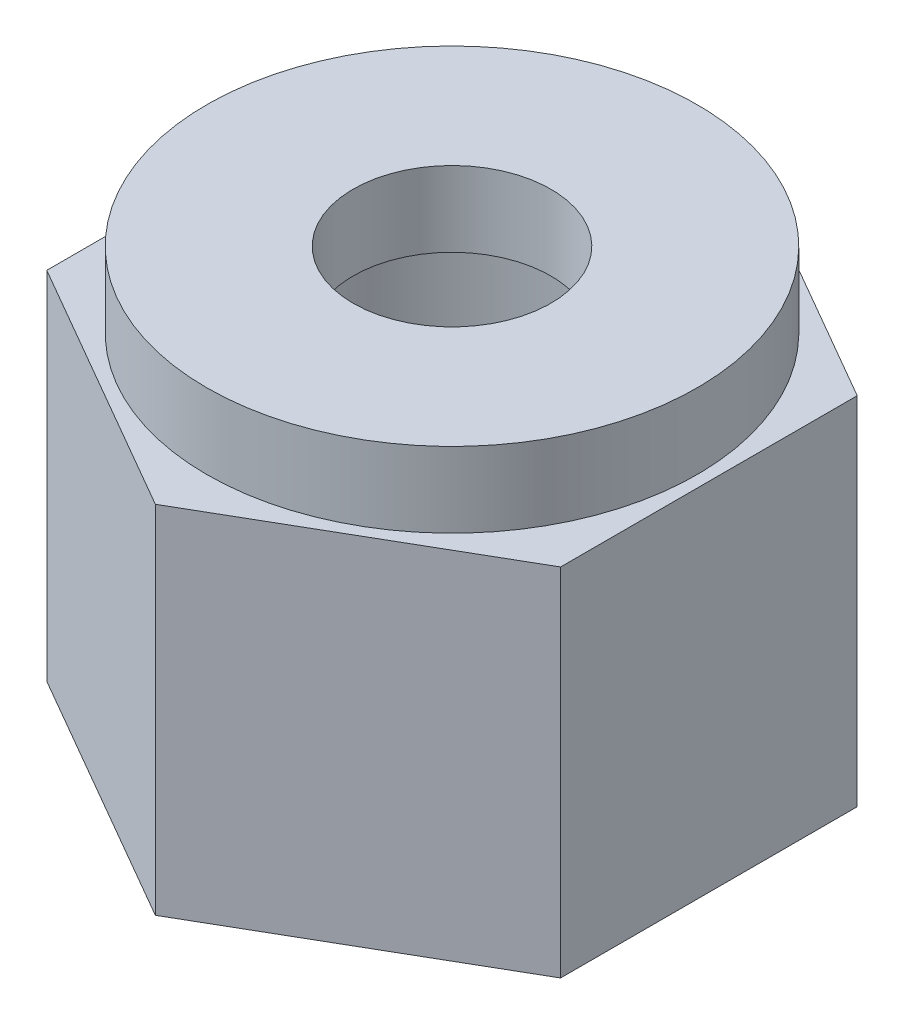
ISO-10303-21;
HEADER;
FILE_DESCRIPTION(('STEP AP214'),'2;1');
FILE_NAME('part.step','',(''),(''),'','','');
FILE_SCHEMA(('AUTOMOTIVE_DESIGN { 1 0 10303 214 1 1 1 1 }'));
ENDSEC;
DATA;
#1=APPLICATION_CONTEXT('core data for automotive mechanical design processes');
#2=APPLICATION_PROTOCOL_DEFINITION('international standard','automotive_design',2000,#1);
#3=PRODUCT_CONTEXT('',#1,'mechanical');
#4=PRODUCT('Part','Part','',(#3));
#5=PRODUCT_RELATED_PRODUCT_CATEGORY('part','',(#4));
#6=PRODUCT_DEFINITION_FORMATION('','',#4);
#7=PRODUCT_DEFINITION_CONTEXT('part definition',#1,'design');
#8=PRODUCT_DEFINITION('design','',#6,#7);
#9=PRODUCT_DEFINITION_SHAPE('','',#8);
#10=(LENGTH_UNIT() NAMED_UNIT(*) SI_UNIT(.MILLI.,.METRE.));
#11=(NAMED_UNIT(*) PLANE_ANGLE_UNIT() SI_UNIT($,.RADIAN.));
#12=(NAMED_UNIT(*) SI_UNIT($,.STERADIAN.) SOLID_ANGLE_UNIT());
#13=UNCERTAINTY_MEASURE_WITH_UNIT(LENGTH_MEASURE(1.E-05),#10,'distance_accuracy_value','');
#14=(GEOMETRIC_REPRESENTATION_CONTEXT(3) GLOBAL_UNCERTAINTY_ASSIGNED_CONTEXT((#13)) GLOBAL_UNIT_ASSIGNED_CONTEXT((#10,
#11,#12)) REPRESENTATION_CONTEXT('',''));
#15=CARTESIAN_POINT('',(0.,0.,0.));
#16=DIRECTION('',(0.,0.,1.));
#17=DIRECTION('',(1.,0.,0.));
#18=AXIS2_PLACEMENT_3D('',#15,#16,#17);
#19=CARTESIAN_POINT('',(0.,0.,0.));
#20=DIRECTION('',(0.,1.,0.));
#21=DIRECTION('',(0.,0.,1.));
#22=AXIS2_PLACEMENT_3D('',#19,#20,#21);
#23=PLANE('',#22);
#24=DIRECTION('',(-0.866025403784441,0.,-0.499999999999995));
#25=VECTOR('',#24,1.);
#26=CARTESIAN_POINT('',(12.9903810567665,0.,-7.50000000000014));
#27=LINE('',#26,#25);
#28=CARTESIAN_POINT('',(12.9903810567665,0.,-7.50000000000014));
#29=VERTEX_POINT('',#28);
#30=CARTESIAN_POINT('',(0.,0.,-15.));
#31=VERTEX_POINT('',#30);
#32=EDGE_CURVE('E296',#29,#31,#27,.T.);
#33=ORIENTED_EDGE('',*,*,#32,.T.);
#34=DIRECTION('',(-0.866025403784438,0.,0.500000000000001));
#35=VECTOR('',#34,1.);
#36=CARTESIAN_POINT('',(0.,0.,-15.));
#37=LINE('',#36,#35);
#38=CARTESIAN_POINT('',(-12.9903810567666,0.,-7.49999999999995));
#39=VERTEX_POINT('',#38);
#40=EDGE_CURVE('E308',#31,#39,#37,.T.);
#41=ORIENTED_EDGE('',*,*,#40,.T.);
#42=DIRECTION('',(0.,0.,1.));
#43=VECTOR('',#42,1.);
#44=CARTESIAN_POINT('',(-12.9903810567666,0.,-7.49999999999995));
#45=LINE('',#44,#43);
#46=CARTESIAN_POINT('',(-12.9903810567665,0.,7.50000000000004));
#47=VERTEX_POINT('',#46);
#48=EDGE_CURVE('E317',#39,#47,#45,.T.);
#49=ORIENTED_EDGE('',*,*,#48,.T.);
#50=DIRECTION('',(0.866025403784442,0.,0.499999999999995));
#51=VECTOR('',#50,1.);
#52=CARTESIAN_POINT('',(-12.9903810567665,0.,7.50000000000004));
#53=LINE('',#52,#51);
#54=CARTESIAN_POINT('',(1.02348685082632E-13,0.,15.));
#55=VERTEX_POINT('',#54);
#56=EDGE_CURVE('E142',#47,#55,#53,.T.);
#57=ORIENTED_EDGE('',*,*,#56,.T.);
#58=DIRECTION('',(0.866025403784435,0.,-0.500000000000007));
#59=VECTOR('',#58,1.);
#60=CARTESIAN_POINT('',(1.04744440165294E-13,0.,15.));
#61=LINE('',#60,#59);
#62=CARTESIAN_POINT('',(12.9903810567666,0.,7.49999999999986));
#63=VERTEX_POINT('',#62);
#64=EDGE_CURVE('E64',#55,#63,#61,.T.);
#65=ORIENTED_EDGE('',*,*,#64,.T.);
#66=DIRECTION('',(0.,0.,-1.));
#67=VECTOR('',#66,1.);
#68=CARTESIAN_POINT('',(12.9903810567666,0.,7.49999999999986));
#69=LINE('',#68,#67);
#70=EDGE_CURVE('E12',#63,#29,#69,.T.);
#71=ORIENTED_EDGE('',*,*,#70,.T.);
#72=EDGE_LOOP('',(#33,#41,#49,#57,#65,#71));
#73=FACE_BOUND('',#72,.T.);
#74=CARTESIAN_POINT('',(0.,0.,0.));
#75=DIRECTION('',(0.,1.,0.));
#76=DIRECTION('',(0.,0.,1.));
#77=AXIS2_PLACEMENT_3D('',#74,#75,#76);
#78=CIRCLE('',#77,12.4);
#79=CARTESIAN_POINT('',(0.,0.,12.4));
#80=VERTEX_POINT('',#79);
#81=EDGE_CURVE('E404',#80,#80,#78,.T.);
#82=ORIENTED_EDGE('',*,*,#81,.F.);
#83=EDGE_LOOP('',(#82));
#84=FACE_BOUND('',#83,.T.);
#85=ADVANCED_FACE('F55',(#73,#84),#23,.T.);
#86=CARTESIAN_POINT('',(0.,-18.,0.));
#87=DIRECTION('',(0.,1.,0.));
#88=DIRECTION('',(0.,0.,1.));
#89=AXIS2_PLACEMENT_3D('',#86,#87,#88);
#90=PLANE('',#89);
#91=CARTESIAN_POINT('',(0.,-18.,0.));
#92=DIRECTION('',(0.,-1.,0.));
#93=DIRECTION('',(0.,0.,-1.));
#94=AXIS2_PLACEMENT_3D('',#91,#92,#93);
#95=CIRCLE('',#94,10.188);
#96=CARTESIAN_POINT('',(0.,-18.,-10.188));
#97=VERTEX_POINT('',#96);
#98=EDGE_CURVE('E136',#97,#97,#95,.T.);
#99=ORIENTED_EDGE('',*,*,#98,.F.);
#100=EDGE_LOOP('',(#99));
#101=FACE_BOUND('',#100,.T.);
#102=DIRECTION('',(0.,0.,1.));
#103=VECTOR('',#102,1.);
#104=CARTESIAN_POINT('',(-12.9903810567666,-18.,-7.49999999999995));
#105=LINE('',#104,#103);
#106=CARTESIAN_POINT('',(-12.9903810567666,-18.,-7.49999999999995));
#107=VERTEX_POINT('',#106);
#108=CARTESIAN_POINT('',(-12.9903810567665,-18.,7.50000000000004));
#109=VERTEX_POINT('',#108);
#110=EDGE_CURVE('E115',#107,#109,#105,.T.);
#111=ORIENTED_EDGE('',*,*,#110,.F.);
#112=DIRECTION('',(-0.866025403784438,0.,0.500000000000001));
#113=VECTOR('',#112,1.);
#114=CARTESIAN_POINT('',(0.,-18.,-15.));
#115=LINE('',#114,#113);
#116=CARTESIAN_POINT('',(0.,-18.,-15.));
#117=VERTEX_POINT('',#116);
#118=EDGE_CURVE('E144',#117,#107,#115,.T.);
#119=ORIENTED_EDGE('',*,*,#118,.F.);
#120=DIRECTION('',(-0.866025403784441,0.,-0.499999999999995));
#121=VECTOR('',#120,1.);
#122=CARTESIAN_POINT('',(12.9903810567665,-18.,-7.50000000000014));
#123=LINE('',#122,#121);
#124=CARTESIAN_POINT('',(12.9903810567665,-18.,-7.50000000000014));
#125=VERTEX_POINT('',#124);
#126=EDGE_CURVE('E148',#125,#117,#123,.T.);
#127=ORIENTED_EDGE('',*,*,#126,.F.);
#128=DIRECTION('',(0.,0.,-1.));
#129=VECTOR('',#128,1.);
#130=CARTESIAN_POINT('',(12.9903810567666,-18.,7.49999999999986));
#131=LINE('',#130,#129);
#132=CARTESIAN_POINT('',(12.9903810567666,-18.,7.49999999999986));
#133=VERTEX_POINT('',#132);
#134=EDGE_CURVE('E248',#133,#125,#131,.T.);
#135=ORIENTED_EDGE('',*,*,#134,.F.);
#136=DIRECTION('',(0.866025403784435,0.,-0.500000000000007));
#137=VECTOR('',#136,1.);
#138=CARTESIAN_POINT('',(1.04744440165294E-13,-18.,15.));
#139=LINE('',#138,#137);
#140=CARTESIAN_POINT('',(1.04744440165294E-13,-18.,15.));
#141=VERTEX_POINT('',#140);
#142=EDGE_CURVE('E117',#141,#133,#139,.T.);
#143=ORIENTED_EDGE('',*,*,#142,.F.);
#144=DIRECTION('',(0.866025403784442,0.,0.499999999999995));
#145=VECTOR('',#144,1.);
#146=CARTESIAN_POINT('',(-12.9903810567665,-18.,7.50000000000004));
#147=LINE('',#146,#145);
#148=EDGE_CURVE('E111',#109,#141,#147,.T.);
#149=ORIENTED_EDGE('',*,*,#148,.F.);
#150=EDGE_LOOP('',(#111,#119,#127,#135,#143,#149));
#151=FACE_BOUND('',#150,.T.);
#152=ADVANCED_FACE('F114',(#101,#151),#90,.F.);
#153=CARTESIAN_POINT('',(-12.9903810567665,0.,0.));
#154=DIRECTION('',(1.,0.,0.));
#155=DIRECTION('',(0.,0.,-1.));
#156=AXIS2_PLACEMENT_3D('',#153,#154,#155);
#157=PLANE('',#156);
#158=DIRECTION('',(0.,1.,0.));
#159=VECTOR('',#158,1.);
#160=CARTESIAN_POINT('',(-12.9903810567665,-18.,7.50000000000004));
#161=LINE('',#160,#159);
#162=EDGE_CURVE('E131',#109,#47,#161,.T.);
#163=ORIENTED_EDGE('',*,*,#162,.T.);
#164=ORIENTED_EDGE('',*,*,#48,.F.);
#165=DIRECTION('',(0.,1.,0.));
#166=VECTOR('',#165,1.);
#167=CARTESIAN_POINT('',(-12.9903810567666,-18.,-7.49999999999995));
#168=LINE('',#167,#166);
#169=EDGE_CURVE('E134',#107,#39,#168,.T.);
#170=ORIENTED_EDGE('',*,*,#169,.F.);
#171=ORIENTED_EDGE('',*,*,#110,.T.);
#172=EDGE_LOOP('',(#163,#164,#170,#171));
#173=FACE_BOUND('',#172,.T.);
#174=ADVANCED_FACE('F130',(#173),#157,.F.);
#175=CARTESIAN_POINT('',(-6.49519052838329,0.,-11.25));
#176=DIRECTION('',(0.500000000000001,0.,0.866025403784438));
#177=DIRECTION('',(0.866025403784438,0.,-0.500000000000001));
#178=AXIS2_PLACEMENT_3D('',#175,#176,#177);
#179=PLANE('',#178);
#180=ORIENTED_EDGE('',*,*,#169,.T.);
#181=ORIENTED_EDGE('',*,*,#40,.F.);
#182=DIRECTION('',(0.,1.,0.));
#183=VECTOR('',#182,1.);
#184=CARTESIAN_POINT('',(0.,-18.,-15.));
#185=LINE('',#184,#183);
#186=EDGE_CURVE('E265',#117,#31,#185,.T.);
#187=ORIENTED_EDGE('',*,*,#186,.F.);
#188=ORIENTED_EDGE('',*,*,#118,.T.);
#189=EDGE_LOOP('',(#180,#181,#187,#188));
#190=FACE_BOUND('',#189,.T.);
#191=ADVANCED_FACE('F171',(#190),#179,.F.);
#192=CARTESIAN_POINT('',(-6.49519052838321,0.,11.25));
#193=DIRECTION('',(0.499999999999995,0.,-0.866025403784442));
#194=DIRECTION('',(-0.866025403784442,0.,-0.499999999999995));
#195=AXIS2_PLACEMENT_3D('',#192,#193,#194);
#196=PLANE('',#195);
#197=DIRECTION('',(0.,1.,0.));
#198=VECTOR('',#197,1.);
#199=CARTESIAN_POINT('',(1.04744440165294E-13,-18.,15.));
#200=LINE('',#199,#198);
#201=EDGE_CURVE('E146',#141,#55,#200,.T.);
#202=ORIENTED_EDGE('',*,*,#201,.T.);
#203=ORIENTED_EDGE('',*,*,#56,.F.);
#204=ORIENTED_EDGE('',*,*,#162,.F.);
#205=ORIENTED_EDGE('',*,*,#148,.T.);
#206=EDGE_LOOP('',(#202,#203,#204,#205));
#207=FACE_BOUND('',#206,.T.);
#208=ADVANCED_FACE('F140',(#207),#196,.F.);
#209=CARTESIAN_POINT('',(6.49519052838336,0.,11.2499999999999));
#210=DIRECTION('',(-0.500000000000007,0.,-0.866025403784435));
#211=DIRECTION('',(-0.866025403784435,0.,0.500000000000007));
#212=AXIS2_PLACEMENT_3D('',#209,#210,#211);
#213=PLANE('',#212);
#214=DIRECTION('',(0.,1.,0.));
#215=VECTOR('',#214,1.);
#216=CARTESIAN_POINT('',(12.9903810567666,-18.,7.49999999999986));
#217=LINE('',#216,#215);
#218=EDGE_CURVE('E79',#133,#63,#217,.T.);
#219=ORIENTED_EDGE('',*,*,#218,.T.);
#220=ORIENTED_EDGE('',*,*,#64,.F.);
#221=ORIENTED_EDGE('',*,*,#201,.F.);
#222=ORIENTED_EDGE('',*,*,#142,.T.);
#223=EDGE_LOOP('',(#219,#220,#221,#222));
#224=FACE_BOUND('',#223,.T.);
#225=ADVANCED_FACE('F170',(#224),#213,.F.);
#226=CARTESIAN_POINT('',(12.9903810567665,0.,-1.36710628485081E-13));
#227=DIRECTION('',(-1.,0.,0.));
#228=DIRECTION('',(0.,0.,1.));
#229=AXIS2_PLACEMENT_3D('',#226,#227,#228);
#230=PLANE('',#229);
#231=DIRECTION('',(0.,1.,0.));
#232=VECTOR('',#231,1.);
#233=CARTESIAN_POINT('',(12.9903810567665,-18.,-7.50000000000014));
#234=LINE('',#233,#232);
#235=EDGE_CURVE('E263',#125,#29,#234,.T.);
#236=ORIENTED_EDGE('',*,*,#235,.T.);
#237=ORIENTED_EDGE('',*,*,#70,.F.);
#238=ORIENTED_EDGE('',*,*,#218,.F.);
#239=ORIENTED_EDGE('',*,*,#134,.T.);
#240=EDGE_LOOP('',(#236,#237,#238,#239));
#241=FACE_BOUND('',#240,.T.);
#242=ADVANCED_FACE('F261',(#241),#230,.F.);
#243=CARTESIAN_POINT('',(6.49519052838323,0.,-11.2500000000001));
#244=DIRECTION('',(-0.499999999999995,0.,0.866025403784442));
#245=DIRECTION('',(0.866025403784442,0.,0.499999999999995));
#246=AXIS2_PLACEMENT_3D('',#243,#244,#245);
#247=PLANE('',#246);
#248=ORIENTED_EDGE('',*,*,#186,.T.);
#249=ORIENTED_EDGE('',*,*,#32,.F.);
#250=ORIENTED_EDGE('',*,*,#235,.F.);
#251=ORIENTED_EDGE('',*,*,#126,.T.);
#252=EDGE_LOOP('',(#248,#249,#250,#251));
#253=FACE_BOUND('',#252,.T.);
#254=ADVANCED_FACE('F282',(#253),#247,.F.);
#255=CARTESIAN_POINT('',(0.,9.99999999994061E-05,0.));
#256=DIRECTION('',(0.,-1.,0.));
#257=DIRECTION('',(0.,0.,-1.));
#258=AXIS2_PLACEMENT_3D('',#255,#256,#257);
#259=CYLINDRICAL_SURFACE('',#258,10.188);
#260=CARTESIAN_POINT('',(0.,0.,0.));
#261=DIRECTION('',(0.,1.,0.));
#262=DIRECTION('',(0.,0.,1.));
#263=AXIS2_PLACEMENT_3D('',#260,#261,#262);
#264=CIRCLE('',#263,10.188);
#265=CARTESIAN_POINT('',(0.,0.,10.188));
#266=VERTEX_POINT('',#265);
#267=EDGE_CURVE('E401',#266,#266,#264,.T.);
#268=ORIENTED_EDGE('',*,*,#267,.T.);
#269=EDGE_LOOP('',(#268));
#270=FACE_BOUND('',#269,.T.);
#271=ORIENTED_EDGE('',*,*,#98,.T.);
#272=EDGE_LOOP('',(#271));
#273=FACE_BOUND('',#272,.T.);
#274=ADVANCED_FACE('F219',(#270,#273),#259,.F.);
#275=CARTESIAN_POINT('',(0.,3.8,0.));
#276=DIRECTION('',(0.,-1.,0.));
#277=DIRECTION('',(0.,0.,-1.));
#278=AXIS2_PLACEMENT_3D('',#275,#276,#277);
#279=CYLINDRICAL_SURFACE('',#278,12.4);
#280=ORIENTED_EDGE('',*,*,#81,.T.);
#281=EDGE_LOOP('',(#280));
#282=FACE_BOUND('',#281,.T.);
#283=CARTESIAN_POINT('',(0.,3.8,0.));
#284=DIRECTION('',(0.,1.,0.));
#285=DIRECTION('',(0.,0.,1.));
#286=AXIS2_PLACEMENT_3D('',#283,#284,#285);
#287=CIRCLE('',#286,12.4);
#288=CARTESIAN_POINT('',(0.,3.8,12.4));
#289=VERTEX_POINT('',#288);
#290=EDGE_CURVE('E409',#289,#289,#287,.T.);
#291=ORIENTED_EDGE('',*,*,#290,.F.);
#292=EDGE_LOOP('',(#291));
#293=FACE_BOUND('',#292,.T.);
#294=ADVANCED_FACE('F430',(#282,#293),#279,.T.);
#295=CARTESIAN_POINT('',(0.,3.8,0.));
#296=DIRECTION('',(0.,1.,0.));
#297=DIRECTION('',(0.,0.,1.));
#298=AXIS2_PLACEMENT_3D('',#295,#296,#297);
#299=PLANE('',#298);
#300=CARTESIAN_POINT('',(0.,3.8,0.));
#301=DIRECTION('',(0.,1.,0.));
#302=DIRECTION('',(0.,0.,1.));
#303=AXIS2_PLACEMENT_3D('',#300,#301,#302);
#304=CIRCLE('',#303,5.);
#305=CARTESIAN_POINT('',(0.,3.8,5.));
#306=VERTEX_POINT('',#305);
#307=EDGE_CURVE('E447',#306,#306,#304,.T.);
#308=ORIENTED_EDGE('',*,*,#307,.F.);
#309=EDGE_LOOP('',(#308));
#310=FACE_BOUND('',#309,.T.);
#311=ORIENTED_EDGE('',*,*,#290,.T.);
#312=EDGE_LOOP('',(#311));
#313=FACE_BOUND('',#312,.T.);
#314=ADVANCED_FACE('F419',(#310,#313),#299,.T.);
#315=CARTESIAN_POINT('',(0.,0.,0.));
#316=DIRECTION('',(0.,1.,0.));
#317=DIRECTION('',(0.,0.,1.));
#318=AXIS2_PLACEMENT_3D('',#315,#316,#317);
#319=PLANE('',#318);
#320=CARTESIAN_POINT('',(0.,0.,0.));
#321=DIRECTION('',(0.,1.,0.));
#322=DIRECTION('',(0.,0.,1.));
#323=AXIS2_PLACEMENT_3D('',#320,#321,#322);
#324=CIRCLE('',#323,5.);
#325=CARTESIAN_POINT('',(0.,0.,5.));
#326=VERTEX_POINT('',#325);
#327=EDGE_CURVE('E59',#326,#326,#324,.T.);
#328=ORIENTED_EDGE('',*,*,#327,.T.);
#329=EDGE_LOOP('',(#328));
#330=FACE_BOUND('',#329,.T.);
#331=ORIENTED_EDGE('',*,*,#267,.F.);
#332=EDGE_LOOP('',(#331));
#333=FACE_BOUND('',#332,.T.);
#334=ADVANCED_FACE('F429',(#330,#333),#319,.F.);
#335=CARTESIAN_POINT('',(0.,-18.0001,0.));
#336=DIRECTION('',(0.,1.,0.));
#337=DIRECTION('',(0.,0.,1.));
#338=AXIS2_PLACEMENT_3D('',#335,#336,#337);
#339=CYLINDRICAL_SURFACE('',#338,5.);
#340=ORIENTED_EDGE('',*,*,#307,.T.);
#341=EDGE_LOOP('',(#340));
#342=FACE_BOUND('',#341,.T.);
#343=ORIENTED_EDGE('',*,*,#327,.F.);
#344=EDGE_LOOP('',(#343));
#345=FACE_BOUND('',#344,.T.);
#346=ADVANCED_FACE('F432',(#342,#345),#339,.F.);
#347=CLOSED_SHELL('',(#85,#152,#174,#191,#208,#225,#242,#254,#274,#294,#314,#334,#346));
#348=MANIFOLD_SOLID_BREP('B2',#347);
#349=ADVANCED_BREP_SHAPE_REPRESENTATION('',(#18,#348),#14);
#350=SHAPE_DEFINITION_REPRESENTATION(#9,#349);
ENDSEC;
END-ISO-10303-21;
